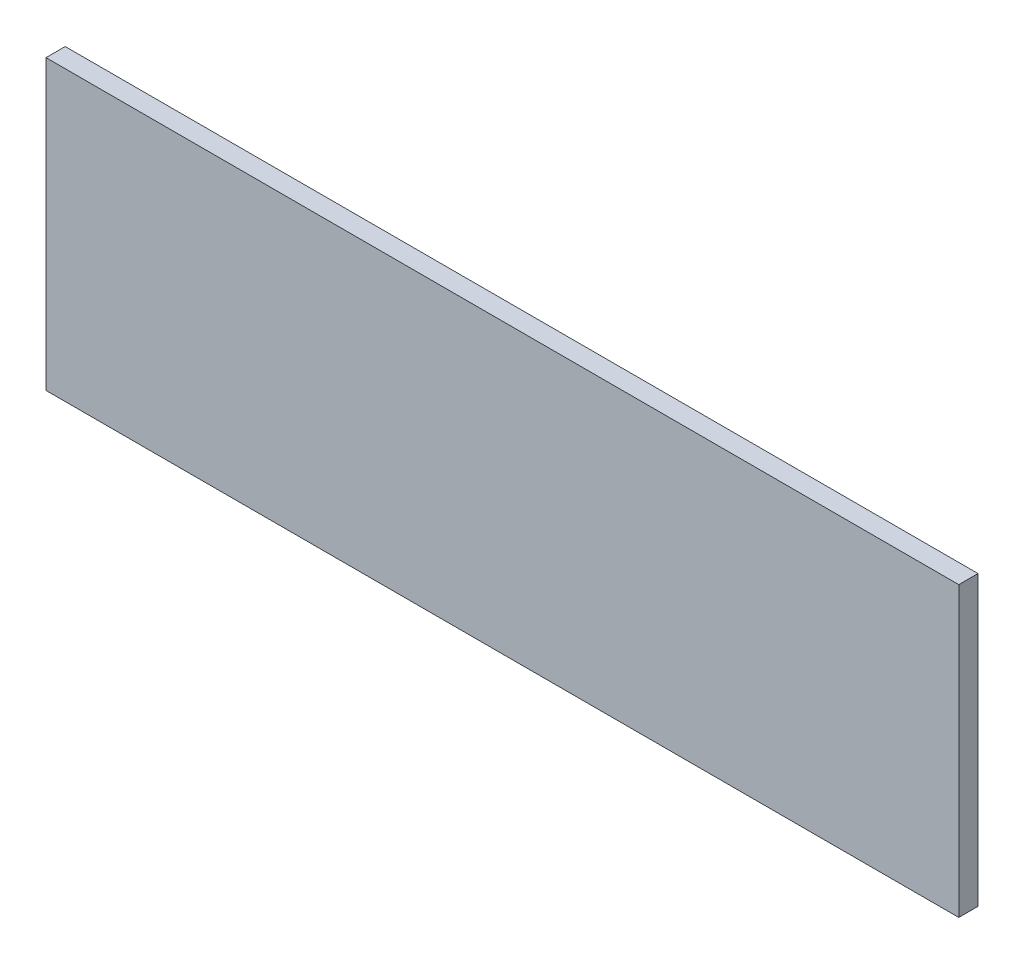
ISO-10303-21;
HEADER;
FILE_DESCRIPTION(('STEP AP214'),'2;1');
FILE_NAME('part.step','',(''),(''),'','','');
FILE_SCHEMA(('AUTOMOTIVE_DESIGN { 1 0 10303 214 1 1 1 1 }'));
ENDSEC;
DATA;
#1=APPLICATION_CONTEXT('core data for automotive mechanical design processes');
#2=APPLICATION_PROTOCOL_DEFINITION('international standard','automotive_design',2000,#1);
#3=PRODUCT_CONTEXT('',#1,'mechanical');
#4=PRODUCT('Part','Part','',(#3));
#5=PRODUCT_RELATED_PRODUCT_CATEGORY('part','',(#4));
#6=PRODUCT_DEFINITION_FORMATION('','',#4);
#7=PRODUCT_DEFINITION_CONTEXT('part definition',#1,'design');
#8=PRODUCT_DEFINITION('design','',#6,#7);
#9=PRODUCT_DEFINITION_SHAPE('','',#8);
#10=(LENGTH_UNIT() NAMED_UNIT(*) SI_UNIT(.MILLI.,.METRE.));
#11=(NAMED_UNIT(*) PLANE_ANGLE_UNIT() SI_UNIT($,.RADIAN.));
#12=(NAMED_UNIT(*) SI_UNIT($,.STERADIAN.) SOLID_ANGLE_UNIT());
#13=UNCERTAINTY_MEASURE_WITH_UNIT(LENGTH_MEASURE(1.E-05),#10,'distance_accuracy_value','');
#14=(GEOMETRIC_REPRESENTATION_CONTEXT(3) GLOBAL_UNCERTAINTY_ASSIGNED_CONTEXT((#13)) GLOBAL_UNIT_ASSIGNED_CONTEXT((#10,
#11,#12)) REPRESENTATION_CONTEXT('',''));
#15=CARTESIAN_POINT('',(0.,0.,0.));
#16=DIRECTION('',(0.,0.,1.));
#17=DIRECTION('',(1.,0.,0.));
#18=AXIS2_PLACEMENT_3D('',#15,#16,#17);
#19=CARTESIAN_POINT('',(0.,0.,2.));
#20=DIRECTION('',(1.,0.,0.));
#21=DIRECTION('',(0.,0.,-1.));
#22=AXIS2_PLACEMENT_3D('',#19,#20,#21);
#23=PLANE('',#22);
#24=DIRECTION('',(0.,-1.,0.));
#25=VECTOR('',#24,1.);
#26=CARTESIAN_POINT('',(0.,0.,-2.));
#27=LINE('',#26,#25);
#28=CARTESIAN_POINT('',(0.,60.,-2.));
#29=VERTEX_POINT('',#28);
#30=CARTESIAN_POINT('',(0.,0.,-2.));
#31=VERTEX_POINT('',#30);
#32=EDGE_CURVE('E113',#29,#31,#27,.T.);
#33=ORIENTED_EDGE('',*,*,#32,.T.);
#34=DIRECTION('',(0.,0.,-1.));
#35=VECTOR('',#34,1.);
#36=CARTESIAN_POINT('',(0.,0.,2.));
#37=LINE('',#36,#35);
#38=CARTESIAN_POINT('',(0.,0.,2.));
#39=VERTEX_POINT('',#38);
#40=EDGE_CURVE('E11',#39,#31,#37,.T.);
#41=ORIENTED_EDGE('',*,*,#40,.F.);
#42=DIRECTION('',(0.,-1.,0.));
#43=VECTOR('',#42,1.);
#44=CARTESIAN_POINT('',(0.,0.,2.));
#45=LINE('',#44,#43);
#46=CARTESIAN_POINT('',(0.,60.,2.));
#47=VERTEX_POINT('',#46);
#48=EDGE_CURVE('E97',#47,#39,#45,.T.);
#49=ORIENTED_EDGE('',*,*,#48,.F.);
#50=DIRECTION('',(0.,0.,-1.));
#51=VECTOR('',#50,1.);
#52=CARTESIAN_POINT('',(0.,60.,2.));
#53=LINE('',#52,#51);
#54=EDGE_CURVE('E109',#47,#29,#53,.T.);
#55=ORIENTED_EDGE('',*,*,#54,.T.);
#56=EDGE_LOOP('',(#33,#41,#49,#55));
#57=FACE_BOUND('',#56,.T.);
#58=ADVANCED_FACE('F45',(#57),#23,.F.);
#59=CARTESIAN_POINT('',(0.,0.,2.));
#60=DIRECTION('',(0.,1.,0.));
#61=DIRECTION('',(0.,0.,1.));
#62=AXIS2_PLACEMENT_3D('',#59,#60,#61);
#63=PLANE('',#62);
#64=DIRECTION('',(1.,0.,0.));
#65=VECTOR('',#64,1.);
#66=CARTESIAN_POINT('',(0.,0.,-2.));
#67=LINE('',#66,#65);
#68=CARTESIAN_POINT('',(190.,0.,-2.));
#69=VERTEX_POINT('',#68);
#70=EDGE_CURVE('E102',#31,#69,#67,.T.);
#71=ORIENTED_EDGE('',*,*,#70,.T.);
#72=DIRECTION('',(0.,0.,-1.));
#73=VECTOR('',#72,1.);
#74=CARTESIAN_POINT('',(190.,0.,2.));
#75=LINE('',#74,#73);
#76=CARTESIAN_POINT('',(190.,0.,2.));
#77=VERTEX_POINT('',#76);
#78=EDGE_CURVE('E54',#77,#69,#75,.T.);
#79=ORIENTED_EDGE('',*,*,#78,.F.);
#80=DIRECTION('',(1.,0.,0.));
#81=VECTOR('',#80,1.);
#82=CARTESIAN_POINT('',(0.,0.,2.));
#83=LINE('',#82,#81);
#84=EDGE_CURVE('E92',#39,#77,#83,.T.);
#85=ORIENTED_EDGE('',*,*,#84,.F.);
#86=ORIENTED_EDGE('',*,*,#40,.T.);
#87=EDGE_LOOP('',(#71,#79,#85,#86));
#88=FACE_BOUND('',#87,.T.);
#89=ADVANCED_FACE('F101',(#88),#63,.F.);
#90=CARTESIAN_POINT('',(190.,0.,2.));
#91=DIRECTION('',(-1.,0.,0.));
#92=DIRECTION('',(0.,0.,1.));
#93=AXIS2_PLACEMENT_3D('',#90,#91,#92);
#94=PLANE('',#93);
#95=DIRECTION('',(0.,1.,0.));
#96=VECTOR('',#95,1.);
#97=CARTESIAN_POINT('',(190.,0.,-2.));
#98=LINE('',#97,#96);
#99=CARTESIAN_POINT('',(190.,60.,-2.));
#100=VERTEX_POINT('',#99);
#101=EDGE_CURVE('E79',#69,#100,#98,.T.);
#102=ORIENTED_EDGE('',*,*,#101,.T.);
#103=DIRECTION('',(0.,0.,-1.));
#104=VECTOR('',#103,1.);
#105=CARTESIAN_POINT('',(190.,60.,2.));
#106=LINE('',#105,#104);
#107=CARTESIAN_POINT('',(190.,60.,2.));
#108=VERTEX_POINT('',#107);
#109=EDGE_CURVE('E104',#108,#100,#106,.T.);
#110=ORIENTED_EDGE('',*,*,#109,.F.);
#111=DIRECTION('',(0.,1.,0.));
#112=VECTOR('',#111,1.);
#113=CARTESIAN_POINT('',(190.,0.,2.));
#114=LINE('',#113,#112);
#115=EDGE_CURVE('E95',#77,#108,#114,.T.);
#116=ORIENTED_EDGE('',*,*,#115,.F.);
#117=ORIENTED_EDGE('',*,*,#78,.T.);
#118=EDGE_LOOP('',(#102,#110,#116,#117));
#119=FACE_BOUND('',#118,.T.);
#120=ADVANCED_FACE('F105',(#119),#94,.F.);
#121=CARTESIAN_POINT('',(0.,60.,2.));
#122=DIRECTION('',(0.,-1.,0.));
#123=DIRECTION('',(0.,0.,-1.));
#124=AXIS2_PLACEMENT_3D('',#121,#122,#123);
#125=PLANE('',#124);
#126=DIRECTION('',(-1.,0.,0.));
#127=VECTOR('',#126,1.);
#128=CARTESIAN_POINT('',(0.,60.,-2.));
#129=LINE('',#128,#127);
#130=EDGE_CURVE('E85',#100,#29,#129,.T.);
#131=ORIENTED_EDGE('',*,*,#130,.T.);
#132=ORIENTED_EDGE('',*,*,#54,.F.);
#133=DIRECTION('',(-1.,0.,0.));
#134=VECTOR('',#133,1.);
#135=CARTESIAN_POINT('',(0.,60.,2.));
#136=LINE('',#135,#134);
#137=EDGE_CURVE('E62',#108,#47,#136,.T.);
#138=ORIENTED_EDGE('',*,*,#137,.F.);
#139=ORIENTED_EDGE('',*,*,#109,.T.);
#140=EDGE_LOOP('',(#131,#132,#138,#139));
#141=FACE_BOUND('',#140,.T.);
#142=ADVANCED_FACE('F126',(#141),#125,.F.);
#143=CARTESIAN_POINT('',(0.,0.,2.));
#144=DIRECTION('',(0.,0.,-1.));
#145=DIRECTION('',(-1.,0.,0.));
#146=AXIS2_PLACEMENT_3D('',#143,#144,#145);
#147=PLANE('',#146);
#148=ORIENTED_EDGE('',*,*,#48,.T.);
#149=ORIENTED_EDGE('',*,*,#84,.T.);
#150=ORIENTED_EDGE('',*,*,#115,.T.);
#151=ORIENTED_EDGE('',*,*,#137,.T.);
#152=EDGE_LOOP('',(#148,#149,#150,#151));
#153=FACE_BOUND('',#152,.T.);
#154=ADVANCED_FACE('F93',(#153),#147,.F.);
#155=CARTESIAN_POINT('',(0.,0.,-2.));
#156=DIRECTION('',(0.,0.,-1.));
#157=DIRECTION('',(-1.,0.,0.));
#158=AXIS2_PLACEMENT_3D('',#155,#156,#157);
#159=PLANE('',#158);
#160=ORIENTED_EDGE('',*,*,#32,.F.);
#161=ORIENTED_EDGE('',*,*,#130,.F.);
#162=ORIENTED_EDGE('',*,*,#101,.F.);
#163=ORIENTED_EDGE('',*,*,#70,.F.);
#164=EDGE_LOOP('',(#160,#161,#162,#163));
#165=FACE_BOUND('',#164,.T.);
#166=ADVANCED_FACE('F129',(#165),#159,.T.);
#167=CLOSED_SHELL('',(#58,#89,#120,#142,#154,#166));
#168=MANIFOLD_SOLID_BREP('B2',#167);
#169=ADVANCED_BREP_SHAPE_REPRESENTATION('',(#18,#168),#14);
#170=SHAPE_DEFINITION_REPRESENTATION(#9,#169);
ENDSEC;
END-ISO-10303-21;
